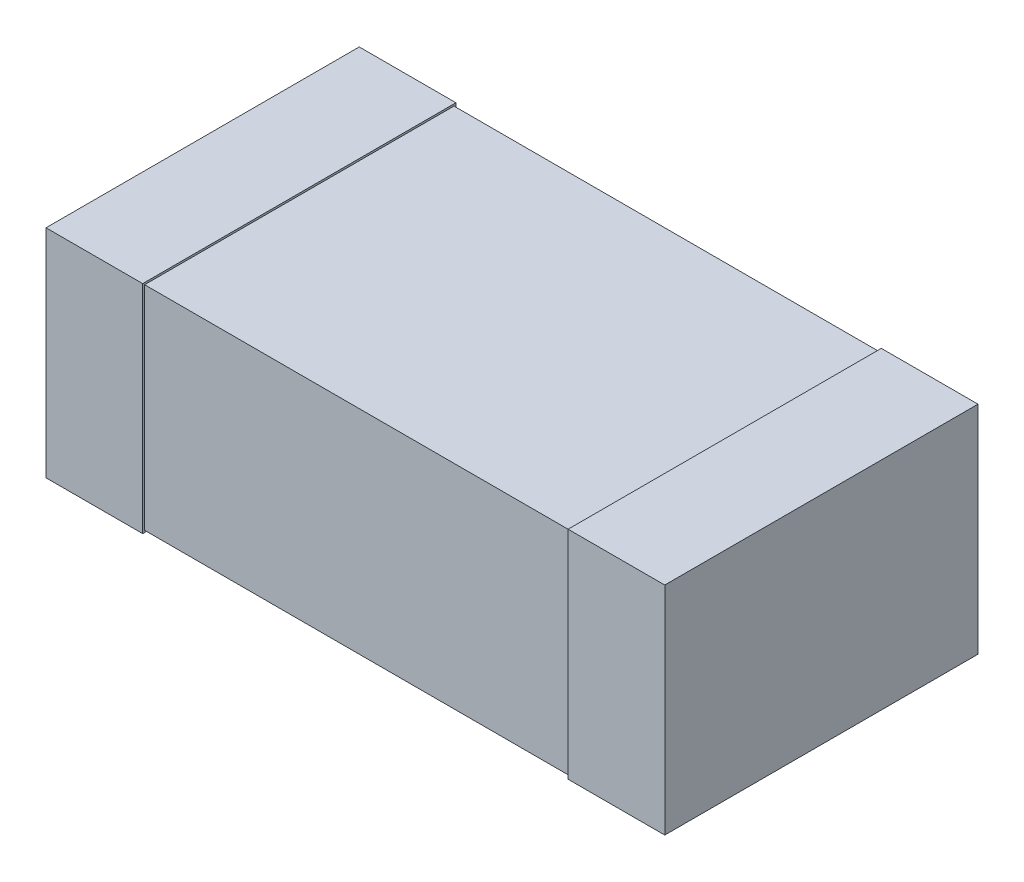
ISO-10303-21;
HEADER;
FILE_DESCRIPTION(('STEP AP214'),'2;1');
FILE_NAME('part.step','',(''),(''),'','','');
FILE_SCHEMA(('AUTOMOTIVE_DESIGN { 1 0 10303 214 1 1 1 1 }'));
ENDSEC;
DATA;
#1=APPLICATION_CONTEXT('core data for automotive mechanical design processes');
#2=APPLICATION_PROTOCOL_DEFINITION('international standard','automotive_design',2000,#1);
#3=PRODUCT_CONTEXT('',#1,'mechanical');
#4=PRODUCT('Part','Part','',(#3));
#5=PRODUCT_RELATED_PRODUCT_CATEGORY('part','',(#4));
#6=PRODUCT_DEFINITION_FORMATION('','',#4);
#7=PRODUCT_DEFINITION_CONTEXT('part definition',#1,'design');
#8=PRODUCT_DEFINITION('design','',#6,#7);
#9=PRODUCT_DEFINITION_SHAPE('','',#8);
#10=(LENGTH_UNIT() NAMED_UNIT(*) SI_UNIT(.MILLI.,.METRE.));
#11=(NAMED_UNIT(*) PLANE_ANGLE_UNIT() SI_UNIT($,.RADIAN.));
#12=(NAMED_UNIT(*) SI_UNIT($,.STERADIAN.) SOLID_ANGLE_UNIT());
#13=UNCERTAINTY_MEASURE_WITH_UNIT(LENGTH_MEASURE(1.E-05),#10,'distance_accuracy_value','');
#14=(GEOMETRIC_REPRESENTATION_CONTEXT(3) GLOBAL_UNCERTAINTY_ASSIGNED_CONTEXT((#13)) GLOBAL_UNIT_ASSIGNED_CONTEXT((#10,
#11,#12)) REPRESENTATION_CONTEXT('',''));
#15=CARTESIAN_POINT('',(0.,0.,0.));
#16=DIRECTION('',(0.,0.,1.));
#17=DIRECTION('',(1.,0.,0.));
#18=AXIS2_PLACEMENT_3D('',#15,#16,#17);
#19=CARTESIAN_POINT('',(-1.6,1.1,0.8));
#20=DIRECTION('',(0.,0.,-1.));
#21=DIRECTION('',(-1.,0.,0.));
#22=AXIS2_PLACEMENT_3D('',#19,#20,#21);
#23=PLANE('',#22);
#24=DIRECTION('',(0.,-1.,0.));
#25=VECTOR('',#24,1.);
#26=CARTESIAN_POINT('',(1.1,1.1,0.8));
#27=LINE('',#26,#25);
#28=CARTESIAN_POINT('',(1.1,1.1,0.8));
#29=VERTEX_POINT('',#28);
#30=CARTESIAN_POINT('',(1.1,0.,0.8));
#31=VERTEX_POINT('',#30);
#32=EDGE_CURVE('E50',#29,#31,#27,.T.);
#33=ORIENTED_EDGE('',*,*,#32,.F.);
#34=DIRECTION('',(1.,0.,0.));
#35=VECTOR('',#34,1.);
#36=CARTESIAN_POINT('',(-1.6,1.1,0.8));
#37=LINE('',#36,#35);
#38=CARTESIAN_POINT('',(-1.1,1.1,0.8));
#39=VERTEX_POINT('',#38);
#40=EDGE_CURVE('E214',#39,#29,#37,.T.);
#41=ORIENTED_EDGE('',*,*,#40,.F.);
#42=DIRECTION('',(0.,1.,0.));
#43=VECTOR('',#42,1.);
#44=CARTESIAN_POINT('',(-1.1,1.1,0.8));
#45=LINE('',#44,#43);
#46=CARTESIAN_POINT('',(-1.1,0.,0.8));
#47=VERTEX_POINT('',#46);
#48=EDGE_CURVE('E208',#47,#39,#45,.T.);
#49=ORIENTED_EDGE('',*,*,#48,.F.);
#50=DIRECTION('',(1.,0.,0.));
#51=VECTOR('',#50,1.);
#52=CARTESIAN_POINT('',(-1.6,0.,0.8));
#53=LINE('',#52,#51);
#54=EDGE_CURVE('E213',#47,#31,#53,.T.);
#55=ORIENTED_EDGE('',*,*,#54,.T.);
#56=EDGE_LOOP('',(#33,#41,#49,#55));
#57=FACE_BOUND('',#56,.T.);
#58=ADVANCED_FACE('F35',(#57),#23,.F.);
#59=CARTESIAN_POINT('',(-1.6,1.1,-0.8));
#60=DIRECTION('',(0.,0.,1.));
#61=DIRECTION('',(1.,0.,0.));
#62=AXIS2_PLACEMENT_3D('',#59,#60,#61);
#63=PLANE('',#62);
#64=DIRECTION('',(0.,1.,0.));
#65=VECTOR('',#64,1.);
#66=CARTESIAN_POINT('',(1.1,1.1,-0.800000000000001));
#67=LINE('',#66,#65);
#68=CARTESIAN_POINT('',(1.1,0.,-0.800000000000001));
#69=VERTEX_POINT('',#68);
#70=CARTESIAN_POINT('',(1.1,1.1,-0.800000000000001));
#71=VERTEX_POINT('',#70);
#72=EDGE_CURVE('E164',#69,#71,#67,.T.);
#73=ORIENTED_EDGE('',*,*,#72,.F.);
#74=DIRECTION('',(-1.,0.,0.));
#75=VECTOR('',#74,1.);
#76=CARTESIAN_POINT('',(-1.6,0.,-0.8));
#77=LINE('',#76,#75);
#78=CARTESIAN_POINT('',(-1.1,0.,-0.8));
#79=VERTEX_POINT('',#78);
#80=EDGE_CURVE('E217',#69,#79,#77,.T.);
#81=ORIENTED_EDGE('',*,*,#80,.T.);
#82=DIRECTION('',(0.,-1.,0.));
#83=VECTOR('',#82,1.);
#84=CARTESIAN_POINT('',(-1.1,1.1,-0.8));
#85=LINE('',#84,#83);
#86=CARTESIAN_POINT('',(-1.1,1.1,-0.8));
#87=VERTEX_POINT('',#86);
#88=EDGE_CURVE('E200',#87,#79,#85,.T.);
#89=ORIENTED_EDGE('',*,*,#88,.F.);
#90=DIRECTION('',(-1.,0.,0.));
#91=VECTOR('',#90,1.);
#92=CARTESIAN_POINT('',(-1.6,1.1,-0.8));
#93=LINE('',#92,#91);
#94=EDGE_CURVE('E216',#71,#87,#93,.T.);
#95=ORIENTED_EDGE('',*,*,#94,.F.);
#96=EDGE_LOOP('',(#73,#81,#89,#95));
#97=FACE_BOUND('',#96,.T.);
#98=ADVANCED_FACE('F234',(#97),#63,.F.);
#99=CARTESIAN_POINT('',(0.,1.1,0.));
#100=DIRECTION('',(0.,1.,0.));
#101=DIRECTION('',(0.,0.,1.));
#102=AXIS2_PLACEMENT_3D('',#99,#100,#101);
#103=PLANE('',#102);
#104=ORIENTED_EDGE('',*,*,#40,.T.);
#105=DIRECTION('',(0.,0.,-1.));
#106=VECTOR('',#105,1.);
#107=CARTESIAN_POINT('',(1.1,1.1,0.));
#108=LINE('',#107,#106);
#109=EDGE_CURVE('E57',#29,#71,#108,.T.);
#110=ORIENTED_EDGE('',*,*,#109,.T.);
#111=ORIENTED_EDGE('',*,*,#94,.T.);
#112=DIRECTION('',(0.,0.,1.));
#113=VECTOR('',#112,1.);
#114=CARTESIAN_POINT('',(-1.1,1.1,0.));
#115=LINE('',#114,#113);
#116=EDGE_CURVE('E211',#87,#39,#115,.T.);
#117=ORIENTED_EDGE('',*,*,#116,.T.);
#118=EDGE_LOOP('',(#104,#110,#111,#117));
#119=FACE_BOUND('',#118,.T.);
#120=ADVANCED_FACE('F231',(#119),#103,.T.);
#121=CARTESIAN_POINT('',(0.,0.,0.));
#122=DIRECTION('',(0.,1.,0.));
#123=DIRECTION('',(0.,0.,1.));
#124=AXIS2_PLACEMENT_3D('',#121,#122,#123);
#125=PLANE('',#124);
#126=DIRECTION('',(0.,0.,-1.));
#127=VECTOR('',#126,1.);
#128=CARTESIAN_POINT('',(1.1,0.,0.));
#129=LINE('',#128,#127);
#130=EDGE_CURVE('E11',#31,#69,#129,.T.);
#131=ORIENTED_EDGE('',*,*,#130,.F.);
#132=ORIENTED_EDGE('',*,*,#54,.F.);
#133=DIRECTION('',(0.,0.,1.));
#134=VECTOR('',#133,1.);
#135=CARTESIAN_POINT('',(-1.1,0.,0.));
#136=LINE('',#135,#134);
#137=EDGE_CURVE('E43',#79,#47,#136,.T.);
#138=ORIENTED_EDGE('',*,*,#137,.F.);
#139=ORIENTED_EDGE('',*,*,#80,.F.);
#140=EDGE_LOOP('',(#131,#132,#138,#139));
#141=FACE_BOUND('',#140,.T.);
#142=ADVANCED_FACE('F229',(#141),#125,.F.);
#143=CARTESIAN_POINT('',(-1.1,1.11,-0.81));
#144=DIRECTION('',(0.,0.,-1.));
#145=DIRECTION('',(-1.,0.,0.));
#146=AXIS2_PLACEMENT_3D('',#143,#144,#145);
#147=PLANE('',#146);
#148=DIRECTION('',(0.,-1.,0.));
#149=VECTOR('',#148,1.);
#150=CARTESIAN_POINT('',(-1.6,1.11,-0.81));
#151=LINE('',#150,#149);
#152=CARTESIAN_POINT('',(-1.6,1.11,-0.81));
#153=VERTEX_POINT('',#152);
#154=CARTESIAN_POINT('',(-1.6,-0.01,-0.81));
#155=VERTEX_POINT('',#154);
#156=EDGE_CURVE('E173',#153,#155,#151,.T.);
#157=ORIENTED_EDGE('',*,*,#156,.F.);
#158=DIRECTION('',(-1.,0.,0.));
#159=VECTOR('',#158,1.);
#160=CARTESIAN_POINT('',(-1.1,1.11,-0.81));
#161=LINE('',#160,#159);
#162=CARTESIAN_POINT('',(-1.1,1.11,-0.81));
#163=VERTEX_POINT('',#162);
#164=EDGE_CURVE('E198',#163,#153,#161,.T.);
#165=ORIENTED_EDGE('',*,*,#164,.F.);
#166=DIRECTION('',(0.,-1.,0.));
#167=VECTOR('',#166,1.);
#168=CARTESIAN_POINT('',(-1.1,1.11,-0.81));
#169=LINE('',#168,#167);
#170=CARTESIAN_POINT('',(-1.1,-0.01,-0.81));
#171=VERTEX_POINT('',#170);
#172=EDGE_CURVE('E174',#163,#171,#169,.T.);
#173=ORIENTED_EDGE('',*,*,#172,.T.);
#174=DIRECTION('',(-1.,0.,0.));
#175=VECTOR('',#174,1.);
#176=CARTESIAN_POINT('',(-1.1,-0.01,-0.81));
#177=LINE('',#176,#175);
#178=EDGE_CURVE('E187',#171,#155,#177,.T.);
#179=ORIENTED_EDGE('',*,*,#178,.T.);
#180=EDGE_LOOP('',(#157,#165,#173,#179));
#181=FACE_BOUND('',#180,.T.);
#182=ADVANCED_FACE('F275',(#181),#147,.T.);
#183=CARTESIAN_POINT('',(-1.1,1.11,0.81));
#184=DIRECTION('',(0.,1.,0.));
#185=DIRECTION('',(0.,0.,1.));
#186=AXIS2_PLACEMENT_3D('',#183,#184,#185);
#187=PLANE('',#186);
#188=DIRECTION('',(0.,0.,-1.));
#189=VECTOR('',#188,1.);
#190=CARTESIAN_POINT('',(-1.6,1.11,0.81));
#191=LINE('',#190,#189);
#192=CARTESIAN_POINT('',(-1.6,1.11,0.81));
#193=VERTEX_POINT('',#192);
#194=EDGE_CURVE('E178',#193,#153,#191,.T.);
#195=ORIENTED_EDGE('',*,*,#194,.F.);
#196=DIRECTION('',(-1.,0.,0.));
#197=VECTOR('',#196,1.);
#198=CARTESIAN_POINT('',(-1.1,1.11,0.81));
#199=LINE('',#198,#197);
#200=CARTESIAN_POINT('',(-1.1,1.11,0.81));
#201=VERTEX_POINT('',#200);
#202=EDGE_CURVE('E201',#201,#193,#199,.T.);
#203=ORIENTED_EDGE('',*,*,#202,.F.);
#204=DIRECTION('',(0.,0.,-1.));
#205=VECTOR('',#204,1.);
#206=CARTESIAN_POINT('',(-1.1,1.11,0.81));
#207=LINE('',#206,#205);
#208=EDGE_CURVE('E184',#201,#163,#207,.T.);
#209=ORIENTED_EDGE('',*,*,#208,.T.);
#210=ORIENTED_EDGE('',*,*,#164,.T.);
#211=EDGE_LOOP('',(#195,#203,#209,#210));
#212=FACE_BOUND('',#211,.T.);
#213=ADVANCED_FACE('F271',(#212),#187,.T.);
#214=CARTESIAN_POINT('',(-1.1,-0.01,0.81));
#215=DIRECTION('',(0.,0.,1.));
#216=DIRECTION('',(1.,0.,0.));
#217=AXIS2_PLACEMENT_3D('',#214,#215,#216);
#218=PLANE('',#217);
#219=DIRECTION('',(0.,1.,0.));
#220=VECTOR('',#219,1.);
#221=CARTESIAN_POINT('',(-1.6,-0.01,0.81));
#222=LINE('',#221,#220);
#223=CARTESIAN_POINT('',(-1.6,-0.01,0.81));
#224=VERTEX_POINT('',#223);
#225=EDGE_CURVE('E193',#224,#193,#222,.T.);
#226=ORIENTED_EDGE('',*,*,#225,.F.);
#227=DIRECTION('',(-1.,0.,0.));
#228=VECTOR('',#227,1.);
#229=CARTESIAN_POINT('',(-1.1,-0.01,0.81));
#230=LINE('',#229,#228);
#231=CARTESIAN_POINT('',(-1.1,-0.01,0.81));
#232=VERTEX_POINT('',#231);
#233=EDGE_CURVE('E203',#232,#224,#230,.T.);
#234=ORIENTED_EDGE('',*,*,#233,.F.);
#235=DIRECTION('',(0.,1.,0.));
#236=VECTOR('',#235,1.);
#237=CARTESIAN_POINT('',(-1.1,-0.01,0.81));
#238=LINE('',#237,#236);
#239=EDGE_CURVE('E181',#232,#201,#238,.T.);
#240=ORIENTED_EDGE('',*,*,#239,.T.);
#241=ORIENTED_EDGE('',*,*,#202,.T.);
#242=EDGE_LOOP('',(#226,#234,#240,#241));
#243=FACE_BOUND('',#242,.T.);
#244=ADVANCED_FACE('F274',(#243),#218,.T.);
#245=CARTESIAN_POINT('',(-1.1,-0.01,-0.81));
#246=DIRECTION('',(0.,-1.,0.));
#247=DIRECTION('',(0.,0.,-1.));
#248=AXIS2_PLACEMENT_3D('',#245,#246,#247);
#249=PLANE('',#248);
#250=DIRECTION('',(0.,0.,1.));
#251=VECTOR('',#250,1.);
#252=CARTESIAN_POINT('',(-1.6,-0.01,-0.81));
#253=LINE('',#252,#251);
#254=EDGE_CURVE('E190',#155,#224,#253,.T.);
#255=ORIENTED_EDGE('',*,*,#254,.F.);
#256=ORIENTED_EDGE('',*,*,#178,.F.);
#257=DIRECTION('',(0.,0.,1.));
#258=VECTOR('',#257,1.);
#259=CARTESIAN_POINT('',(-1.1,-0.01,-0.81));
#260=LINE('',#259,#258);
#261=EDGE_CURVE('E177',#171,#232,#260,.T.);
#262=ORIENTED_EDGE('',*,*,#261,.T.);
#263=ORIENTED_EDGE('',*,*,#233,.T.);
#264=EDGE_LOOP('',(#255,#256,#262,#263));
#265=FACE_BOUND('',#264,.T.);
#266=ADVANCED_FACE('F270',(#265),#249,.T.);
#267=CARTESIAN_POINT('',(-1.1,0.,0.));
#268=DIRECTION('',(-1.,0.,0.));
#269=DIRECTION('',(0.,0.,1.));
#270=AXIS2_PLACEMENT_3D('',#267,#268,#269);
#271=PLANE('',#270);
#272=ORIENTED_EDGE('',*,*,#116,.F.);
#273=ORIENTED_EDGE('',*,*,#88,.T.);
#274=ORIENTED_EDGE('',*,*,#137,.T.);
#275=ORIENTED_EDGE('',*,*,#48,.T.);
#276=EDGE_LOOP('',(#272,#273,#274,#275));
#277=FACE_BOUND('',#276,.T.);
#278=ORIENTED_EDGE('',*,*,#172,.F.);
#279=ORIENTED_EDGE('',*,*,#208,.F.);
#280=ORIENTED_EDGE('',*,*,#239,.F.);
#281=ORIENTED_EDGE('',*,*,#261,.F.);
#282=EDGE_LOOP('',(#278,#279,#280,#281));
#283=FACE_BOUND('',#282,.T.);
#284=ADVANCED_FACE('F224',(#277,#283),#271,.F.);
#285=CARTESIAN_POINT('',(-1.6,1.1,-0.8));
#286=DIRECTION('',(1.,0.,0.));
#287=DIRECTION('',(0.,0.,-1.));
#288=AXIS2_PLACEMENT_3D('',#285,#286,#287);
#289=PLANE('',#288);
#290=ORIENTED_EDGE('',*,*,#156,.T.);
#291=ORIENTED_EDGE('',*,*,#254,.T.);
#292=ORIENTED_EDGE('',*,*,#225,.T.);
#293=ORIENTED_EDGE('',*,*,#194,.T.);
#294=EDGE_LOOP('',(#290,#291,#292,#293));
#295=FACE_BOUND('',#294,.T.);
#296=ADVANCED_FACE('F37',(#295),#289,.F.);
#297=CARTESIAN_POINT('',(1.1,1.11,-0.81));
#298=DIRECTION('',(0.,0.,1.));
#299=DIRECTION('',(1.,0.,0.));
#300=AXIS2_PLACEMENT_3D('',#297,#298,#299);
#301=PLANE('',#300);
#302=DIRECTION('',(0.,-1.,0.));
#303=VECTOR('',#302,1.);
#304=CARTESIAN_POINT('',(1.6,1.11,-0.81));
#305=LINE('',#304,#303);
#306=CARTESIAN_POINT('',(1.6,1.11,-0.81));
#307=VERTEX_POINT('',#306);
#308=CARTESIAN_POINT('',(1.6,-0.01,-0.81));
#309=VERTEX_POINT('',#308);
#310=EDGE_CURVE('E159',#307,#309,#305,.T.);
#311=ORIENTED_EDGE('',*,*,#310,.T.);
#312=DIRECTION('',(1.,0.,0.));
#313=VECTOR('',#312,1.);
#314=CARTESIAN_POINT('',(1.1,-0.01,-0.81));
#315=LINE('',#314,#313);
#316=CARTESIAN_POINT('',(1.1,-0.01,-0.81));
#317=VERTEX_POINT('',#316);
#318=EDGE_CURVE('E151',#317,#309,#315,.T.);
#319=ORIENTED_EDGE('',*,*,#318,.F.);
#320=DIRECTION('',(0.,-1.,0.));
#321=VECTOR('',#320,1.);
#322=CARTESIAN_POINT('',(1.1,1.11,-0.81));
#323=LINE('',#322,#321);
#324=CARTESIAN_POINT('',(1.1,1.11,-0.81));
#325=VERTEX_POINT('',#324);
#326=EDGE_CURVE('E130',#325,#317,#323,.T.);
#327=ORIENTED_EDGE('',*,*,#326,.F.);
#328=DIRECTION('',(1.,0.,0.));
#329=VECTOR('',#328,1.);
#330=CARTESIAN_POINT('',(1.1,1.11,-0.81));
#331=LINE('',#330,#329);
#332=EDGE_CURVE('E139',#325,#307,#331,.T.);
#333=ORIENTED_EDGE('',*,*,#332,.T.);
#334=EDGE_LOOP('',(#311,#319,#327,#333));
#335=FACE_BOUND('',#334,.T.);
#336=ADVANCED_FACE('F149',(#335),#301,.F.);
#337=CARTESIAN_POINT('',(1.1,-0.01,-0.81));
#338=DIRECTION('',(0.,1.,0.));
#339=DIRECTION('',(0.,0.,1.));
#340=AXIS2_PLACEMENT_3D('',#337,#338,#339);
#341=PLANE('',#340);
#342=DIRECTION('',(0.,0.,1.));
#343=VECTOR('',#342,1.);
#344=CARTESIAN_POINT('',(1.6,-0.01,-0.81));
#345=LINE('',#344,#343);
#346=CARTESIAN_POINT('',(1.6,-0.01,0.81));
#347=VERTEX_POINT('',#346);
#348=EDGE_CURVE('E152',#309,#347,#345,.T.);
#349=ORIENTED_EDGE('',*,*,#348,.T.);
#350=DIRECTION('',(1.,0.,0.));
#351=VECTOR('',#350,1.);
#352=CARTESIAN_POINT('',(1.1,-0.01,0.81));
#353=LINE('',#352,#351);
#354=CARTESIAN_POINT('',(1.1,-0.01,0.81));
#355=VERTEX_POINT('',#354);
#356=EDGE_CURVE('E165',#355,#347,#353,.T.);
#357=ORIENTED_EDGE('',*,*,#356,.F.);
#358=DIRECTION('',(0.,0.,1.));
#359=VECTOR('',#358,1.);
#360=CARTESIAN_POINT('',(1.1,-0.01,-0.81));
#361=LINE('',#360,#359);
#362=EDGE_CURVE('E147',#317,#355,#361,.T.);
#363=ORIENTED_EDGE('',*,*,#362,.F.);
#364=ORIENTED_EDGE('',*,*,#318,.T.);
#365=EDGE_LOOP('',(#349,#357,#363,#364));
#366=FACE_BOUND('',#365,.T.);
#367=ADVANCED_FACE('F254',(#366),#341,.F.);
#368=CARTESIAN_POINT('',(1.1,-0.01,0.81));
#369=DIRECTION('',(0.,0.,-1.));
#370=DIRECTION('',(-1.,0.,0.));
#371=AXIS2_PLACEMENT_3D('',#368,#369,#370);
#372=PLANE('',#371);
#373=DIRECTION('',(0.,1.,0.));
#374=VECTOR('',#373,1.);
#375=CARTESIAN_POINT('',(1.6,-0.01,0.81));
#376=LINE('',#375,#374);
#377=CARTESIAN_POINT('',(1.6,1.11,0.81));
#378=VERTEX_POINT('',#377);
#379=EDGE_CURVE('E154',#347,#378,#376,.T.);
#380=ORIENTED_EDGE('',*,*,#379,.T.);
#381=DIRECTION('',(1.,0.,0.));
#382=VECTOR('',#381,1.);
#383=CARTESIAN_POINT('',(1.1,1.11,0.81));
#384=LINE('',#383,#382);
#385=CARTESIAN_POINT('',(1.1,1.11,0.81));
#386=VERTEX_POINT('',#385);
#387=EDGE_CURVE('E146',#386,#378,#384,.T.);
#388=ORIENTED_EDGE('',*,*,#387,.F.);
#389=DIRECTION('',(0.,1.,0.));
#390=VECTOR('',#389,1.);
#391=CARTESIAN_POINT('',(1.1,-0.01,0.81));
#392=LINE('',#391,#390);
#393=EDGE_CURVE('E133',#355,#386,#392,.T.);
#394=ORIENTED_EDGE('',*,*,#393,.F.);
#395=ORIENTED_EDGE('',*,*,#356,.T.);
#396=EDGE_LOOP('',(#380,#388,#394,#395));
#397=FACE_BOUND('',#396,.T.);
#398=ADVANCED_FACE('F256',(#397),#372,.F.);
#399=CARTESIAN_POINT('',(1.1,1.11,0.81));
#400=DIRECTION('',(0.,-1.,0.));
#401=DIRECTION('',(0.,0.,-1.));
#402=AXIS2_PLACEMENT_3D('',#399,#400,#401);
#403=PLANE('',#402);
#404=DIRECTION('',(0.,0.,-1.));
#405=VECTOR('',#404,1.);
#406=CARTESIAN_POINT('',(1.6,1.11,0.81));
#407=LINE('',#406,#405);
#408=EDGE_CURVE('E142',#378,#307,#407,.T.);
#409=ORIENTED_EDGE('',*,*,#408,.T.);
#410=ORIENTED_EDGE('',*,*,#332,.F.);
#411=DIRECTION('',(0.,0.,-1.));
#412=VECTOR('',#411,1.);
#413=CARTESIAN_POINT('',(1.1,1.11,0.81));
#414=LINE('',#413,#412);
#415=EDGE_CURVE('E126',#386,#325,#414,.T.);
#416=ORIENTED_EDGE('',*,*,#415,.F.);
#417=ORIENTED_EDGE('',*,*,#387,.T.);
#418=EDGE_LOOP('',(#409,#410,#416,#417));
#419=FACE_BOUND('',#418,.T.);
#420=ADVANCED_FACE('F140',(#419),#403,.F.);
#421=CARTESIAN_POINT('',(1.1,0.,0.));
#422=DIRECTION('',(1.,0.,0.));
#423=DIRECTION('',(0.,0.,1.));
#424=AXIS2_PLACEMENT_3D('',#421,#422,#423);
#425=PLANE('',#424);
#426=ORIENTED_EDGE('',*,*,#109,.F.);
#427=ORIENTED_EDGE('',*,*,#32,.T.);
#428=ORIENTED_EDGE('',*,*,#130,.T.);
#429=ORIENTED_EDGE('',*,*,#72,.T.);
#430=EDGE_LOOP('',(#426,#427,#428,#429));
#431=FACE_BOUND('',#430,.T.);
#432=ORIENTED_EDGE('',*,*,#326,.T.);
#433=ORIENTED_EDGE('',*,*,#362,.T.);
#434=ORIENTED_EDGE('',*,*,#393,.T.);
#435=ORIENTED_EDGE('',*,*,#415,.T.);
#436=EDGE_LOOP('',(#432,#433,#434,#435));
#437=FACE_BOUND('',#436,.T.);
#438=ADVANCED_FACE('F128',(#431,#437),#425,.F.);
#439=CARTESIAN_POINT('',(1.6,1.1,-0.800000000000001));
#440=DIRECTION('',(-1.,0.,0.));
#441=DIRECTION('',(0.,0.,1.));
#442=AXIS2_PLACEMENT_3D('',#439,#440,#441);
#443=PLANE('',#442);
#444=ORIENTED_EDGE('',*,*,#310,.F.);
#445=ORIENTED_EDGE('',*,*,#408,.F.);
#446=ORIENTED_EDGE('',*,*,#379,.F.);
#447=ORIENTED_EDGE('',*,*,#348,.F.);
#448=EDGE_LOOP('',(#444,#445,#446,#447));
#449=FACE_BOUND('',#448,.T.);
#450=ADVANCED_FACE('F244',(#449),#443,.F.);
#451=CLOSED_SHELL('',(#58,#98,#120,#142,#182,#213,#244,#266,#284,#296,#336,#367,#398,#420,#438,#450));
#452=MANIFOLD_SOLID_BREP('B2',#451);
#453=ADVANCED_BREP_SHAPE_REPRESENTATION('',(#18,#452),#14);
#454=SHAPE_DEFINITION_REPRESENTATION(#9,#453);
ENDSEC;
END-ISO-10303-21;
